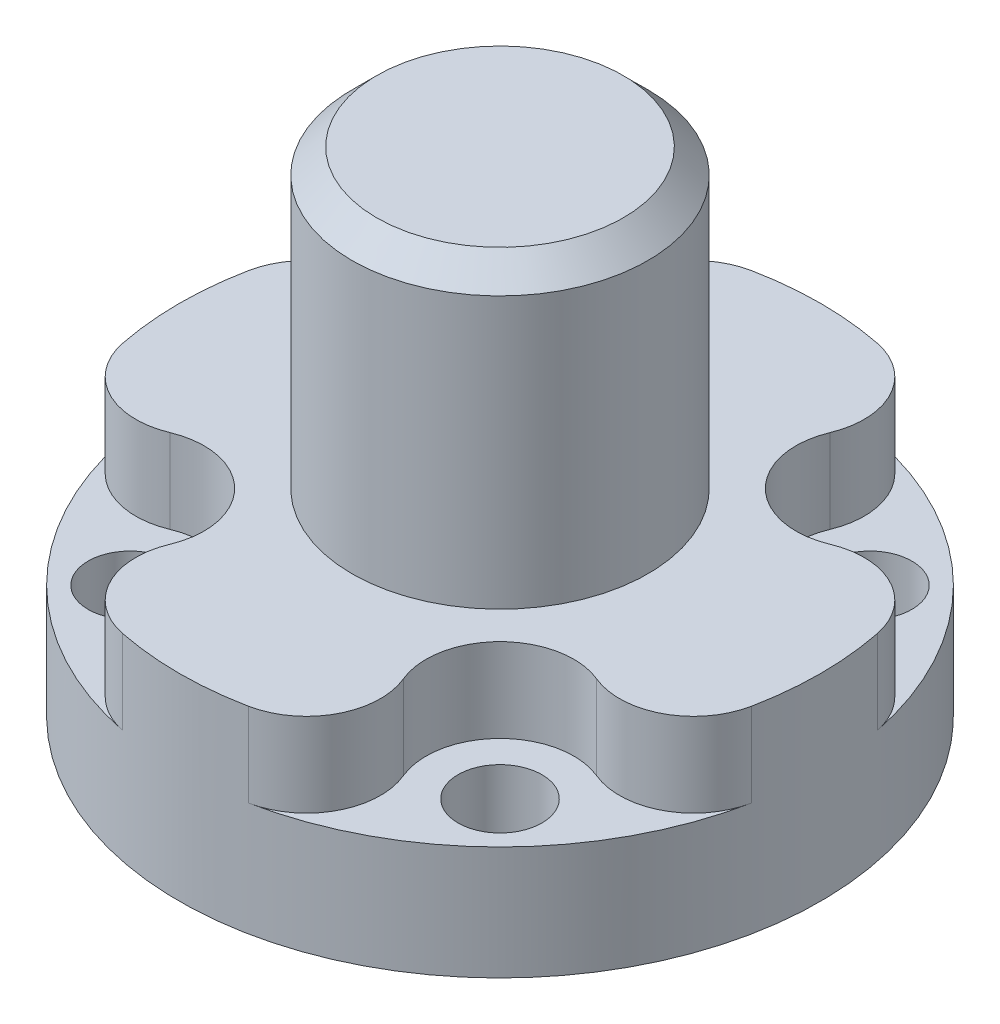
ISO-10303-21;
HEADER;
FILE_DESCRIPTION(('STEP AP214'),'2;1');
FILE_NAME('part.step','',(''),(''),'','','');
FILE_SCHEMA(('AUTOMOTIVE_DESIGN { 1 0 10303 214 1 1 1 1 }'));
ENDSEC;
DATA;
#1=APPLICATION_CONTEXT('core data for automotive mechanical design processes');
#2=APPLICATION_PROTOCOL_DEFINITION('international standard','automotive_design',2000,#1);
#3=PRODUCT_CONTEXT('',#1,'mechanical');
#4=PRODUCT('Part','Part','',(#3));
#5=PRODUCT_RELATED_PRODUCT_CATEGORY('part','',(#4));
#6=PRODUCT_DEFINITION_FORMATION('','',#4);
#7=PRODUCT_DEFINITION_CONTEXT('part definition',#1,'design');
#8=PRODUCT_DEFINITION('design','',#6,#7);
#9=PRODUCT_DEFINITION_SHAPE('','',#8);
#10=(LENGTH_UNIT() NAMED_UNIT(*) SI_UNIT(.MILLI.,.METRE.));
#11=(NAMED_UNIT(*) PLANE_ANGLE_UNIT() SI_UNIT($,.RADIAN.));
#12=(NAMED_UNIT(*) SI_UNIT($,.STERADIAN.) SOLID_ANGLE_UNIT());
#13=UNCERTAINTY_MEASURE_WITH_UNIT(LENGTH_MEASURE(1.E-05),#10,'distance_accuracy_value','');
#14=(GEOMETRIC_REPRESENTATION_CONTEXT(3) GLOBAL_UNCERTAINTY_ASSIGNED_CONTEXT((#13)) GLOBAL_UNIT_ASSIGNED_CONTEXT((#10,
#11,#12)) REPRESENTATION_CONTEXT('',''));
#15=CARTESIAN_POINT('',(0.,0.,0.));
#16=DIRECTION('',(0.,0.,1.));
#17=DIRECTION('',(1.,0.,0.));
#18=AXIS2_PLACEMENT_3D('',#15,#16,#17);
#19=CARTESIAN_POINT('',(0.,20.,0.));
#20=DIRECTION('',(0.,-1.,0.));
#21=DIRECTION('',(0.,0.,-1.));
#22=AXIS2_PLACEMENT_3D('',#19,#20,#21);
#23=CYLINDRICAL_SURFACE('',#22,6.);
#24=CARTESIAN_POINT('',(0.,19.,0.));
#25=DIRECTION('',(0.,1.,0.));
#26=DIRECTION('',(0.,0.,1.));
#27=AXIS2_PLACEMENT_3D('',#24,#25,#26);
#28=CIRCLE('',#27,6.);
#29=CARTESIAN_POINT('',(0.,19.,6.));
#30=VERTEX_POINT('',#29);
#31=EDGE_CURVE('E256',#30,#30,#28,.F.);
#32=ORIENTED_EDGE('',*,*,#31,.T.);
#33=EDGE_LOOP('',(#32));
#34=FACE_BOUND('',#33,.T.);
#35=CARTESIAN_POINT('',(0.,8.,0.));
#36=DIRECTION('',(0.,-1.,0.));
#37=DIRECTION('',(0.,0.,-1.));
#38=AXIS2_PLACEMENT_3D('',#35,#36,#37);
#39=CIRCLE('',#38,6.);
#40=CARTESIAN_POINT('',(0.,8.,-6.));
#41=VERTEX_POINT('',#40);
#42=EDGE_CURVE('E401',#41,#41,#39,.T.);
#43=ORIENTED_EDGE('',*,*,#42,.F.);
#44=EDGE_LOOP('',(#43));
#45=FACE_BOUND('',#44,.T.);
#46=ADVANCED_FACE('F40',(#34,#45),#23,.T.);
#47=CARTESIAN_POINT('',(0.,20.,0.));
#48=DIRECTION('',(0.,1.,0.));
#49=DIRECTION('',(0.,0.,1.));
#50=AXIS2_PLACEMENT_3D('',#47,#48,#49);
#51=PLANE('',#50);
#52=CARTESIAN_POINT('',(0.,20.,0.));
#53=DIRECTION('',(0.,1.,0.));
#54=DIRECTION('',(0.,0.,1.));
#55=AXIS2_PLACEMENT_3D('',#52,#53,#54);
#56=CIRCLE('',#55,5.);
#57=CARTESIAN_POINT('',(0.,20.,5.));
#58=VERTEX_POINT('',#57);
#59=EDGE_CURVE('E253',#58,#58,#56,.T.);
#60=ORIENTED_EDGE('',*,*,#59,.T.);
#61=EDGE_LOOP('',(#60));
#62=FACE_BOUND('',#61,.T.);
#63=ADVANCED_FACE('F275',(#62),#51,.T.);
#64=CARTESIAN_POINT('',(0.,8.,0.));
#65=DIRECTION('',(0.,-1.,0.));
#66=DIRECTION('',(0.,0.,-1.));
#67=AXIS2_PLACEMENT_3D('',#64,#65,#66);
#68=CYLINDRICAL_SURFACE('',#67,13.);
#69=CARTESIAN_POINT('',(0.,8.,0.));
#70=DIRECTION('',(0.,-1.,0.));
#71=DIRECTION('',(0.,0.,-1.));
#72=AXIS2_PLACEMENT_3D('',#69,#70,#71);
#73=CIRCLE('',#72,13.);
#74=CARTESIAN_POINT('',(-2.54901992639096,8.,-12.7476467402757));
#75=VERTEX_POINT('',#74);
#76=CARTESIAN_POINT('',(2.54901992639096,8.,-12.7476467402757));
#77=VERTEX_POINT('',#76);
#78=EDGE_CURVE('E388',#75,#77,#73,.T.);
#79=ORIENTED_EDGE('',*,*,#78,.T.);
#80=DIRECTION('',(0.,-1.,0.));
#81=VECTOR('',#80,1.);
#82=CARTESIAN_POINT('',(2.54901992639096,8.,-12.7476467402757));
#83=LINE('',#82,#81);
#84=CARTESIAN_POINT('',(2.54901992639096,4.6,-12.7476467402757));
#85=VERTEX_POINT('',#84);
#86=EDGE_CURVE('E222',#77,#85,#83,.T.);
#87=ORIENTED_EDGE('',*,*,#86,.T.);
#88=CARTESIAN_POINT('',(0.,4.6,0.));
#89=DIRECTION('',(0.,-1.,0.));
#90=DIRECTION('',(0.,0.,-1.));
#91=AXIS2_PLACEMENT_3D('',#88,#89,#90);
#92=CIRCLE('',#91,13.);
#93=CARTESIAN_POINT('',(12.7476467402757,4.6,-2.54901992639097));
#94=VERTEX_POINT('',#93);
#95=EDGE_CURVE('E163',#94,#85,#92,.F.);
#96=ORIENTED_EDGE('',*,*,#95,.F.);
#97=DIRECTION('',(0.,-1.,0.));
#98=VECTOR('',#97,1.);
#99=CARTESIAN_POINT('',(12.7476467402757,8.,-2.54901992639097));
#100=LINE('',#99,#98);
#101=CARTESIAN_POINT('',(12.7476467402757,8.,-2.54901992639097));
#102=VERTEX_POINT('',#101);
#103=EDGE_CURVE('E210',#94,#102,#100,.F.);
#104=ORIENTED_EDGE('',*,*,#103,.T.);
#105=CARTESIAN_POINT('',(12.7476467402757,8.,2.54901992639096));
#106=VERTEX_POINT('',#105);
#107=EDGE_CURVE('E397',#102,#106,#73,.T.);
#108=ORIENTED_EDGE('',*,*,#107,.T.);
#109=DIRECTION('',(0.,-1.,0.));
#110=VECTOR('',#109,1.);
#111=CARTESIAN_POINT('',(12.7476467402757,8.,2.54901992639096));
#112=LINE('',#111,#110);
#113=CARTESIAN_POINT('',(12.7476467402757,4.6,2.54901992639096));
#114=VERTEX_POINT('',#113);
#115=EDGE_CURVE('E219',#106,#114,#112,.T.);
#116=ORIENTED_EDGE('',*,*,#115,.T.);
#117=CARTESIAN_POINT('',(0.,4.6,0.));
#118=DIRECTION('',(0.,-1.,0.));
#119=DIRECTION('',(0.,0.,-1.));
#120=AXIS2_PLACEMENT_3D('',#117,#118,#119);
#121=CIRCLE('',#120,13.);
#122=CARTESIAN_POINT('',(2.54901992639096,4.6,12.7476467402757));
#123=VERTEX_POINT('',#122);
#124=EDGE_CURVE('E410',#123,#114,#121,.F.);
#125=ORIENTED_EDGE('',*,*,#124,.F.);
#126=DIRECTION('',(0.,-1.,0.));
#127=VECTOR('',#126,1.);
#128=CARTESIAN_POINT('',(2.54901992639096,8.,12.7476467402757));
#129=LINE('',#128,#127);
#130=CARTESIAN_POINT('',(2.54901992639096,8.,12.7476467402757));
#131=VERTEX_POINT('',#130);
#132=EDGE_CURVE('E217',#123,#131,#129,.F.);
#133=ORIENTED_EDGE('',*,*,#132,.T.);
#134=CARTESIAN_POINT('',(-2.54901992639096,8.,12.7476467402757));
#135=VERTEX_POINT('',#134);
#136=EDGE_CURVE('E711',#131,#135,#73,.T.);
#137=ORIENTED_EDGE('',*,*,#136,.T.);
#138=DIRECTION('',(0.,-1.,0.));
#139=VECTOR('',#138,1.);
#140=CARTESIAN_POINT('',(-2.54901992639096,8.,12.7476467402757));
#141=LINE('',#140,#139);
#142=CARTESIAN_POINT('',(-2.54901992639096,4.6,12.7476467402757));
#143=VERTEX_POINT('',#142);
#144=EDGE_CURVE('E214',#135,#143,#141,.T.);
#145=ORIENTED_EDGE('',*,*,#144,.T.);
#146=CARTESIAN_POINT('',(0.,4.6,0.));
#147=DIRECTION('',(0.,-1.,0.));
#148=DIRECTION('',(0.,0.,-1.));
#149=AXIS2_PLACEMENT_3D('',#146,#147,#148);
#150=CIRCLE('',#149,13.);
#151=CARTESIAN_POINT('',(-12.7476467402757,4.6,2.54901992639096));
#152=VERTEX_POINT('',#151);
#153=EDGE_CURVE('E412',#152,#143,#150,.F.);
#154=ORIENTED_EDGE('',*,*,#153,.F.);
#155=DIRECTION('',(0.,-1.,0.));
#156=VECTOR('',#155,1.);
#157=CARTESIAN_POINT('',(-12.7476467402757,8.,2.54901992639096));
#158=LINE('',#157,#156);
#159=CARTESIAN_POINT('',(-12.7476467402757,8.,2.54901992639096));
#160=VERTEX_POINT('',#159);
#161=EDGE_CURVE('E212',#152,#160,#158,.F.);
#162=ORIENTED_EDGE('',*,*,#161,.T.);
#163=CARTESIAN_POINT('',(-12.7476467402757,8.,-2.54901992639096));
#164=VERTEX_POINT('',#163);
#165=EDGE_CURVE('E395',#160,#164,#73,.T.);
#166=ORIENTED_EDGE('',*,*,#165,.T.);
#167=DIRECTION('',(0.,-1.,0.));
#168=VECTOR('',#167,1.);
#169=CARTESIAN_POINT('',(-12.7476467402757,8.,-2.54901992639096));
#170=LINE('',#169,#168);
#171=CARTESIAN_POINT('',(-12.7476467402757,4.6,-2.54901992639096));
#172=VERTEX_POINT('',#171);
#173=EDGE_CURVE('E207',#164,#172,#170,.T.);
#174=ORIENTED_EDGE('',*,*,#173,.T.);
#175=CARTESIAN_POINT('',(0.,4.6,0.));
#176=DIRECTION('',(0.,-1.,0.));
#177=DIRECTION('',(0.,0.,-1.));
#178=AXIS2_PLACEMENT_3D('',#175,#176,#177);
#179=CIRCLE('',#178,13.);
#180=CARTESIAN_POINT('',(-2.54901992639096,4.6,-12.7476467402757));
#181=VERTEX_POINT('',#180);
#182=EDGE_CURVE('E189',#181,#172,#179,.F.);
#183=ORIENTED_EDGE('',*,*,#182,.F.);
#184=DIRECTION('',(0.,-1.,0.));
#185=VECTOR('',#184,1.);
#186=CARTESIAN_POINT('',(-2.54901992639096,8.,-12.7476467402757));
#187=LINE('',#186,#185);
#188=EDGE_CURVE('E205',#181,#75,#187,.F.);
#189=ORIENTED_EDGE('',*,*,#188,.T.);
#190=EDGE_LOOP('',(#79,#87,#96,#104,#108,#116,#125,#133,#137,#145,#154,#162,#166,#174,#183,#189));
#191=FACE_BOUND('',#190,.T.);
#192=CARTESIAN_POINT('',(0.,0.,0.));
#193=DIRECTION('',(0.,-1.,0.));
#194=DIRECTION('',(0.,0.,-1.));
#195=AXIS2_PLACEMENT_3D('',#192,#193,#194);
#196=CIRCLE('',#195,13.);
#197=CARTESIAN_POINT('',(0.,0.,-13.));
#198=VERTEX_POINT('',#197);
#199=EDGE_CURVE('E391',#198,#198,#196,.T.);
#200=ORIENTED_EDGE('',*,*,#199,.F.);
#201=EDGE_LOOP('',(#200));
#202=FACE_BOUND('',#201,.T.);
#203=ADVANCED_FACE('F281',(#191,#202),#68,.T.);
#204=CARTESIAN_POINT('',(0.,8.,0.));
#205=DIRECTION('',(0.,-1.,0.));
#206=DIRECTION('',(0.,0.,-1.));
#207=AXIS2_PLACEMENT_3D('',#204,#205,#206);
#208=PLANE('',#207);
#209=ORIENTED_EDGE('',*,*,#42,.T.);
#210=EDGE_LOOP('',(#209));
#211=FACE_BOUND('',#210,.T.);
#212=CARTESIAN_POINT('',(7.5,8.,-7.5));
#213=DIRECTION('',(0.,-1.,0.));
#214=DIRECTION('',(0.,0.,-1.));
#215=AXIS2_PLACEMENT_3D('',#212,#213,#214);
#216=CIRCLE('',#215,3.);
#217=CARTESIAN_POINT('',(8.65294105395219,8.,-4.73039227938114));
#218=VERTEX_POINT('',#217);
#219=CARTESIAN_POINT('',(4.73039227938114,8.,-8.6529410539522));
#220=VERTEX_POINT('',#219);
#221=EDGE_CURVE('E404',#218,#220,#216,.T.);
#222=ORIENTED_EDGE('',*,*,#221,.T.);
#223=CARTESIAN_POINT('',(1.96078455876228,8.,-9.80588210790439));
#224=DIRECTION('',(0.,-1.,0.));
#225=DIRECTION('',(0.,0.,-1.));
#226=AXIS2_PLACEMENT_3D('',#223,#224,#225);
#227=CIRCLE('',#226,3.);
#228=EDGE_CURVE('E184',#220,#77,#227,.F.);
#229=ORIENTED_EDGE('',*,*,#228,.T.);
#230=ORIENTED_EDGE('',*,*,#78,.F.);
#231=CARTESIAN_POINT('',(-1.96078455876228,8.,-9.80588210790439));
#232=DIRECTION('',(0.,-1.,0.));
#233=DIRECTION('',(0.,0.,-1.));
#234=AXIS2_PLACEMENT_3D('',#231,#232,#233);
#235=CIRCLE('',#234,3.);
#236=CARTESIAN_POINT('',(-4.73039227938114,8.,-8.65294105395219));
#237=VERTEX_POINT('',#236);
#238=EDGE_CURVE('E185',#75,#237,#235,.F.);
#239=ORIENTED_EDGE('',*,*,#238,.T.);
#240=CARTESIAN_POINT('',(-7.5,8.,-7.5));
#241=DIRECTION('',(0.,-1.,0.));
#242=DIRECTION('',(0.,0.,-1.));
#243=AXIS2_PLACEMENT_3D('',#240,#241,#242);
#244=CIRCLE('',#243,3.);
#245=CARTESIAN_POINT('',(-8.6529410539522,8.,-4.73039227938114));
#246=VERTEX_POINT('',#245);
#247=EDGE_CURVE('E414',#237,#246,#244,.T.);
#248=ORIENTED_EDGE('',*,*,#247,.T.);
#249=CARTESIAN_POINT('',(-9.80588210790439,8.,-1.96078455876228));
#250=DIRECTION('',(0.,-1.,0.));
#251=DIRECTION('',(0.,0.,-1.));
#252=AXIS2_PLACEMENT_3D('',#249,#250,#251);
#253=CIRCLE('',#252,3.);
#254=EDGE_CURVE('E187',#246,#164,#253,.F.);
#255=ORIENTED_EDGE('',*,*,#254,.T.);
#256=ORIENTED_EDGE('',*,*,#165,.F.);
#257=CARTESIAN_POINT('',(-9.80588210790439,8.,1.96078455876228));
#258=DIRECTION('',(0.,-1.,0.));
#259=DIRECTION('',(0.,0.,-1.));
#260=AXIS2_PLACEMENT_3D('',#257,#258,#259);
#261=CIRCLE('',#260,3.);
#262=CARTESIAN_POINT('',(-8.6529410539522,8.,4.73039227938114));
#263=VERTEX_POINT('',#262);
#264=EDGE_CURVE('E196',#160,#263,#261,.F.);
#265=ORIENTED_EDGE('',*,*,#264,.T.);
#266=CARTESIAN_POINT('',(-7.5,8.,7.5));
#267=DIRECTION('',(0.,1.,0.));
#268=DIRECTION('',(0.,0.,1.));
#269=AXIS2_PLACEMENT_3D('',#266,#267,#268);
#270=CIRCLE('',#269,3.);
#271=CARTESIAN_POINT('',(-4.73039227938114,8.,8.65294105395219));
#272=VERTEX_POINT('',#271);
#273=EDGE_CURVE('E433',#272,#263,#270,.T.);
#274=ORIENTED_EDGE('',*,*,#273,.F.);
#275=CARTESIAN_POINT('',(-1.96078455876228,8.,9.80588210790439));
#276=DIRECTION('',(0.,-1.,0.));
#277=DIRECTION('',(0.,0.,-1.));
#278=AXIS2_PLACEMENT_3D('',#275,#276,#277);
#279=CIRCLE('',#278,3.);
#280=EDGE_CURVE('E198',#272,#135,#279,.F.);
#281=ORIENTED_EDGE('',*,*,#280,.T.);
#282=ORIENTED_EDGE('',*,*,#136,.F.);
#283=CARTESIAN_POINT('',(1.96078455876228,8.,9.80588210790439));
#284=DIRECTION('',(0.,-1.,0.));
#285=DIRECTION('',(0.,0.,-1.));
#286=AXIS2_PLACEMENT_3D('',#283,#284,#285);
#287=CIRCLE('',#286,3.);
#288=CARTESIAN_POINT('',(4.73039227938114,8.,8.65294105395219));
#289=VERTEX_POINT('',#288);
#290=EDGE_CURVE('E200',#131,#289,#287,.F.);
#291=ORIENTED_EDGE('',*,*,#290,.T.);
#292=CARTESIAN_POINT('',(7.5,8.,7.5));
#293=DIRECTION('',(0.,-1.,0.));
#294=DIRECTION('',(0.,0.,-1.));
#295=AXIS2_PLACEMENT_3D('',#292,#293,#294);
#296=CIRCLE('',#295,3.);
#297=CARTESIAN_POINT('',(8.6529410539522,8.,4.73039227938114));
#298=VERTEX_POINT('',#297);
#299=EDGE_CURVE('E407',#289,#298,#296,.T.);
#300=ORIENTED_EDGE('',*,*,#299,.T.);
#301=CARTESIAN_POINT('',(9.80588210790439,8.,1.96078455876228));
#302=DIRECTION('',(0.,-1.,0.));
#303=DIRECTION('',(0.,0.,-1.));
#304=AXIS2_PLACEMENT_3D('',#301,#302,#303);
#305=CIRCLE('',#304,3.);
#306=EDGE_CURVE('E202',#298,#106,#305,.F.);
#307=ORIENTED_EDGE('',*,*,#306,.T.);
#308=ORIENTED_EDGE('',*,*,#107,.F.);
#309=CARTESIAN_POINT('',(9.80588210790439,8.,-1.96078455876228));
#310=DIRECTION('',(0.,-1.,0.));
#311=DIRECTION('',(0.,0.,-1.));
#312=AXIS2_PLACEMENT_3D('',#309,#310,#311);
#313=CIRCLE('',#312,3.);
#314=EDGE_CURVE('E194',#102,#218,#313,.F.);
#315=ORIENTED_EDGE('',*,*,#314,.T.);
#316=EDGE_LOOP('',(#222,#229,#230,#239,#248,#255,#256,#265,#274,#281,#282,#291,#300,#307,#308,#315));
#317=FACE_BOUND('',#316,.T.);
#318=ADVANCED_FACE('F377',(#211,#317),#208,.F.);
#319=CARTESIAN_POINT('',(0.,0.,0.));
#320=DIRECTION('',(0.,1.,0.));
#321=DIRECTION('',(0.,0.,1.));
#322=AXIS2_PLACEMENT_3D('',#319,#320,#321);
#323=PLANE('',#322);
#324=CARTESIAN_POINT('',(0.,0.,0.));
#325=DIRECTION('',(0.,1.,0.));
#326=DIRECTION('',(0.,0.,1.));
#327=AXIS2_PLACEMENT_3D('',#324,#325,#326);
#328=CIRCLE('',#327,3.);
#329=CARTESIAN_POINT('',(0.,0.,3.));
#330=VERTEX_POINT('',#329);
#331=EDGE_CURVE('E259',#330,#330,#328,.F.);
#332=ORIENTED_EDGE('',*,*,#331,.F.);
#333=EDGE_LOOP('',(#332));
#334=FACE_BOUND('',#333,.T.);
#335=CARTESIAN_POINT('',(-7.5,0.,-7.5));
#336=DIRECTION('',(0.,1.,0.));
#337=DIRECTION('',(0.,0.,1.));
#338=AXIS2_PLACEMENT_3D('',#335,#336,#337);
#339=CIRCLE('',#338,1.7);
#340=CARTESIAN_POINT('',(-7.5,0.,-5.8));
#341=VERTEX_POINT('',#340);
#342=EDGE_CURVE('E428',#341,#341,#339,.T.);
#343=ORIENTED_EDGE('',*,*,#342,.T.);
#344=EDGE_LOOP('',(#343));
#345=FACE_BOUND('',#344,.T.);
#346=CARTESIAN_POINT('',(-7.5,0.,7.5));
#347=DIRECTION('',(0.,1.,0.));
#348=DIRECTION('',(0.,0.,1.));
#349=AXIS2_PLACEMENT_3D('',#346,#347,#348);
#350=CIRCLE('',#349,1.7);
#351=CARTESIAN_POINT('',(-7.5,0.,9.2));
#352=VERTEX_POINT('',#351);
#353=EDGE_CURVE('E442',#352,#352,#350,.T.);
#354=ORIENTED_EDGE('',*,*,#353,.T.);
#355=EDGE_LOOP('',(#354));
#356=FACE_BOUND('',#355,.T.);
#357=CARTESIAN_POINT('',(7.5,0.,7.5));
#358=DIRECTION('',(0.,1.,0.));
#359=DIRECTION('',(0.,0.,1.));
#360=AXIS2_PLACEMENT_3D('',#357,#358,#359);
#361=CIRCLE('',#360,1.7);
#362=CARTESIAN_POINT('',(7.5,0.,9.2));
#363=VERTEX_POINT('',#362);
#364=EDGE_CURVE('E181',#363,#363,#361,.T.);
#365=ORIENTED_EDGE('',*,*,#364,.T.);
#366=EDGE_LOOP('',(#365));
#367=FACE_BOUND('',#366,.T.);
#368=CARTESIAN_POINT('',(7.5,0.,-7.5));
#369=DIRECTION('',(0.,1.,0.));
#370=DIRECTION('',(0.,0.,1.));
#371=AXIS2_PLACEMENT_3D('',#368,#369,#370);
#372=CIRCLE('',#371,1.7);
#373=CARTESIAN_POINT('',(7.5,0.,-5.80000000000001));
#374=VERTEX_POINT('',#373);
#375=EDGE_CURVE('E393',#374,#374,#372,.T.);
#376=ORIENTED_EDGE('',*,*,#375,.T.);
#377=EDGE_LOOP('',(#376));
#378=FACE_BOUND('',#377,.T.);
#379=ORIENTED_EDGE('',*,*,#199,.T.);
#380=EDGE_LOOP('',(#379));
#381=FACE_BOUND('',#380,.T.);
#382=ADVANCED_FACE('F287',(#334,#345,#356,#367,#378,#381),#323,.F.);
#383=CARTESIAN_POINT('',(7.5,8.,-7.5));
#384=DIRECTION('',(0.,1.,0.));
#385=DIRECTION('',(0.,0.,1.));
#386=AXIS2_PLACEMENT_3D('',#383,#384,#385);
#387=CYLINDRICAL_SURFACE('',#386,1.7);
#388=ORIENTED_EDGE('',*,*,#375,.F.);
#389=EDGE_LOOP('',(#388));
#390=FACE_BOUND('',#389,.T.);
#391=CARTESIAN_POINT('',(7.5,4.6,-7.5));
#392=DIRECTION('',(0.,1.,0.));
#393=DIRECTION('',(0.,0.,1.));
#394=AXIS2_PLACEMENT_3D('',#391,#392,#393);
#395=CIRCLE('',#394,1.7);
#396=CARTESIAN_POINT('',(7.5,4.6,-5.8));
#397=VERTEX_POINT('',#396);
#398=EDGE_CURVE('E180',#397,#397,#395,.T.);
#399=ORIENTED_EDGE('',*,*,#398,.T.);
#400=EDGE_LOOP('',(#399));
#401=FACE_BOUND('',#400,.T.);
#402=ADVANCED_FACE('F373',(#390,#401),#387,.F.);
#403=CARTESIAN_POINT('',(9.2,4.6,-7.5));
#404=DIRECTION('',(0.,-1.,0.));
#405=DIRECTION('',(0.,0.,-1.));
#406=AXIS2_PLACEMENT_3D('',#403,#404,#405);
#407=PLANE('',#406);
#408=ORIENTED_EDGE('',*,*,#95,.T.);
#409=CARTESIAN_POINT('',(1.96078455876228,4.6,-9.80588210790439));
#410=DIRECTION('',(0.,-1.,0.));
#411=DIRECTION('',(0.,0.,-1.));
#412=AXIS2_PLACEMENT_3D('',#409,#410,#411);
#413=CIRCLE('',#412,3.);
#414=CARTESIAN_POINT('',(4.73039227938114,4.6,-8.6529410539522));
#415=VERTEX_POINT('',#414);
#416=EDGE_CURVE('E157',#85,#415,#413,.T.);
#417=ORIENTED_EDGE('',*,*,#416,.T.);
#418=CARTESIAN_POINT('',(7.5,4.6,-7.5));
#419=DIRECTION('',(0.,1.,0.));
#420=DIRECTION('',(0.,0.,1.));
#421=AXIS2_PLACEMENT_3D('',#418,#419,#420);
#422=CIRCLE('',#421,3.);
#423=CARTESIAN_POINT('',(8.65294105395219,4.6,-4.73039227938114));
#424=VERTEX_POINT('',#423);
#425=EDGE_CURVE('E162',#415,#424,#422,.T.);
#426=ORIENTED_EDGE('',*,*,#425,.T.);
#427=CARTESIAN_POINT('',(9.80588210790439,4.6,-1.96078455876228));
#428=DIRECTION('',(0.,-1.,0.));
#429=DIRECTION('',(0.,0.,-1.));
#430=AXIS2_PLACEMENT_3D('',#427,#428,#429);
#431=CIRCLE('',#430,3.);
#432=EDGE_CURVE('E249',#424,#94,#431,.T.);
#433=ORIENTED_EDGE('',*,*,#432,.T.);
#434=EDGE_LOOP('',(#408,#417,#426,#433));
#435=FACE_BOUND('',#434,.T.);
#436=ORIENTED_EDGE('',*,*,#398,.F.);
#437=EDGE_LOOP('',(#436));
#438=FACE_BOUND('',#437,.T.);
#439=ADVANCED_FACE('F159',(#435,#438),#407,.F.);
#440=CARTESIAN_POINT('',(7.5,8.,-7.5));
#441=DIRECTION('',(0.,1.,0.));
#442=DIRECTION('',(0.,0.,1.));
#443=AXIS2_PLACEMENT_3D('',#440,#441,#442);
#444=CYLINDRICAL_SURFACE('',#443,3.);
#445=ORIENTED_EDGE('',*,*,#425,.F.);
#446=DIRECTION('',(0.,1.,0.));
#447=VECTOR('',#446,1.);
#448=CARTESIAN_POINT('',(4.73039227938114,8.,-8.6529410539522));
#449=LINE('',#448,#447);
#450=EDGE_CURVE('E176',#415,#220,#449,.T.);
#451=ORIENTED_EDGE('',*,*,#450,.T.);
#452=ORIENTED_EDGE('',*,*,#221,.F.);
#453=DIRECTION('',(0.,1.,0.));
#454=VECTOR('',#453,1.);
#455=CARTESIAN_POINT('',(8.65294105395219,8.,-4.73039227938114));
#456=LINE('',#455,#454);
#457=EDGE_CURVE('E179',#218,#424,#456,.F.);
#458=ORIENTED_EDGE('',*,*,#457,.T.);
#459=EDGE_LOOP('',(#445,#451,#452,#458));
#460=FACE_BOUND('',#459,.T.);
#461=ADVANCED_FACE('F174',(#460),#444,.F.);
#462=CARTESIAN_POINT('',(7.5,8.,7.5));
#463=DIRECTION('',(0.,1.,0.));
#464=DIRECTION('',(0.,0.,1.));
#465=AXIS2_PLACEMENT_3D('',#462,#463,#464);
#466=CYLINDRICAL_SURFACE('',#465,1.7);
#467=ORIENTED_EDGE('',*,*,#364,.F.);
#468=EDGE_LOOP('',(#467));
#469=FACE_BOUND('',#468,.T.);
#470=CARTESIAN_POINT('',(7.5,4.6,7.5));
#471=DIRECTION('',(0.,1.,0.));
#472=DIRECTION('',(0.,0.,1.));
#473=AXIS2_PLACEMENT_3D('',#470,#471,#472);
#474=CIRCLE('',#473,1.7);
#475=CARTESIAN_POINT('',(7.5,4.6,9.2));
#476=VERTEX_POINT('',#475);
#477=EDGE_CURVE('E448',#476,#476,#474,.T.);
#478=ORIENTED_EDGE('',*,*,#477,.T.);
#479=EDGE_LOOP('',(#478));
#480=FACE_BOUND('',#479,.T.);
#481=ADVANCED_FACE('F364',(#469,#480),#466,.F.);
#482=CARTESIAN_POINT('',(9.2,4.6,7.5));
#483=DIRECTION('',(0.,-1.,0.));
#484=DIRECTION('',(0.,0.,-1.));
#485=AXIS2_PLACEMENT_3D('',#482,#483,#484);
#486=PLANE('',#485);
#487=ORIENTED_EDGE('',*,*,#124,.T.);
#488=CARTESIAN_POINT('',(9.80588210790439,4.6,1.96078455876228));
#489=DIRECTION('',(0.,-1.,0.));
#490=DIRECTION('',(0.,0.,-1.));
#491=AXIS2_PLACEMENT_3D('',#488,#489,#490);
#492=CIRCLE('',#491,3.);
#493=CARTESIAN_POINT('',(8.6529410539522,4.6,4.73039227938114));
#494=VERTEX_POINT('',#493);
#495=EDGE_CURVE('E168',#114,#494,#492,.T.);
#496=ORIENTED_EDGE('',*,*,#495,.T.);
#497=CARTESIAN_POINT('',(7.5,4.6,7.5));
#498=DIRECTION('',(0.,1.,0.));
#499=DIRECTION('',(0.,0.,1.));
#500=AXIS2_PLACEMENT_3D('',#497,#498,#499);
#501=CIRCLE('',#500,3.);
#502=CARTESIAN_POINT('',(4.73039227938114,4.6,8.65294105395219));
#503=VERTEX_POINT('',#502);
#504=EDGE_CURVE('E445',#494,#503,#501,.T.);
#505=ORIENTED_EDGE('',*,*,#504,.T.);
#506=CARTESIAN_POINT('',(1.96078455876228,4.6,9.80588210790439));
#507=DIRECTION('',(0.,-1.,0.));
#508=DIRECTION('',(0.,0.,-1.));
#509=AXIS2_PLACEMENT_3D('',#506,#507,#508);
#510=CIRCLE('',#509,3.);
#511=EDGE_CURVE('E241',#503,#123,#510,.T.);
#512=ORIENTED_EDGE('',*,*,#511,.T.);
#513=EDGE_LOOP('',(#487,#496,#505,#512));
#514=FACE_BOUND('',#513,.T.);
#515=ORIENTED_EDGE('',*,*,#477,.F.);
#516=EDGE_LOOP('',(#515));
#517=FACE_BOUND('',#516,.T.);
#518=ADVANCED_FACE('F360',(#514,#517),#486,.F.);
#519=CARTESIAN_POINT('',(7.5,8.,7.5));
#520=DIRECTION('',(0.,1.,0.));
#521=DIRECTION('',(0.,0.,1.));
#522=AXIS2_PLACEMENT_3D('',#519,#520,#521);
#523=CYLINDRICAL_SURFACE('',#522,3.);
#524=ORIENTED_EDGE('',*,*,#504,.F.);
#525=DIRECTION('',(0.,1.,0.));
#526=VECTOR('',#525,1.);
#527=CARTESIAN_POINT('',(8.6529410539522,8.,4.73039227938114));
#528=LINE('',#527,#526);
#529=EDGE_CURVE('E227',#494,#298,#528,.T.);
#530=ORIENTED_EDGE('',*,*,#529,.T.);
#531=ORIENTED_EDGE('',*,*,#299,.F.);
#532=DIRECTION('',(0.,1.,0.));
#533=VECTOR('',#532,1.);
#534=CARTESIAN_POINT('',(4.73039227938114,8.,8.65294105395219));
#535=LINE('',#534,#533);
#536=EDGE_CURVE('E224',#289,#503,#535,.F.);
#537=ORIENTED_EDGE('',*,*,#536,.T.);
#538=EDGE_LOOP('',(#524,#530,#531,#537));
#539=FACE_BOUND('',#538,.T.);
#540=ADVANCED_FACE('F356',(#539),#523,.F.);
#541=CARTESIAN_POINT('',(-7.5,8.,7.5));
#542=DIRECTION('',(0.,1.,0.));
#543=DIRECTION('',(0.,0.,1.));
#544=AXIS2_PLACEMENT_3D('',#541,#542,#543);
#545=CYLINDRICAL_SURFACE('',#544,1.7);
#546=ORIENTED_EDGE('',*,*,#353,.F.);
#547=EDGE_LOOP('',(#546));
#548=FACE_BOUND('',#547,.T.);
#549=CARTESIAN_POINT('',(-7.5,4.6,7.5));
#550=DIRECTION('',(0.,1.,0.));
#551=DIRECTION('',(0.,0.,1.));
#552=AXIS2_PLACEMENT_3D('',#549,#550,#551);
#553=CIRCLE('',#552,1.7);
#554=CARTESIAN_POINT('',(-7.5,4.6,9.2));
#555=VERTEX_POINT('',#554);
#556=EDGE_CURVE('E439',#555,#555,#553,.T.);
#557=ORIENTED_EDGE('',*,*,#556,.T.);
#558=EDGE_LOOP('',(#557));
#559=FACE_BOUND('',#558,.T.);
#560=ADVANCED_FACE('F352',(#548,#559),#545,.F.);
#561=CARTESIAN_POINT('',(-5.8,4.6,7.5));
#562=DIRECTION('',(0.,-1.,0.));
#563=DIRECTION('',(0.,0.,-1.));
#564=AXIS2_PLACEMENT_3D('',#561,#562,#563);
#565=PLANE('',#564);
#566=ORIENTED_EDGE('',*,*,#153,.T.);
#567=CARTESIAN_POINT('',(-1.96078455876228,4.6,9.80588210790439));
#568=DIRECTION('',(0.,-1.,0.));
#569=DIRECTION('',(0.,0.,-1.));
#570=AXIS2_PLACEMENT_3D('',#567,#568,#569);
#571=CIRCLE('',#570,3.);
#572=CARTESIAN_POINT('',(-4.73039227938114,4.6,8.65294105395219));
#573=VERTEX_POINT('',#572);
#574=EDGE_CURVE('E244',#143,#573,#571,.T.);
#575=ORIENTED_EDGE('',*,*,#574,.T.);
#576=CARTESIAN_POINT('',(-7.5,4.6,7.5));
#577=DIRECTION('',(0.,1.,0.));
#578=DIRECTION('',(0.,0.,1.));
#579=AXIS2_PLACEMENT_3D('',#576,#577,#578);
#580=CIRCLE('',#579,3.);
#581=CARTESIAN_POINT('',(-8.6529410539522,4.6,4.73039227938114));
#582=VERTEX_POINT('',#581);
#583=EDGE_CURVE('E436',#573,#582,#580,.T.);
#584=ORIENTED_EDGE('',*,*,#583,.T.);
#585=CARTESIAN_POINT('',(-9.80588210790439,4.6,1.96078455876228));
#586=DIRECTION('',(0.,-1.,0.));
#587=DIRECTION('',(0.,0.,-1.));
#588=AXIS2_PLACEMENT_3D('',#585,#586,#587);
#589=CIRCLE('',#588,3.);
#590=EDGE_CURVE('E246',#582,#152,#589,.T.);
#591=ORIENTED_EDGE('',*,*,#590,.T.);
#592=EDGE_LOOP('',(#566,#575,#584,#591));
#593=FACE_BOUND('',#592,.T.);
#594=ORIENTED_EDGE('',*,*,#556,.F.);
#595=EDGE_LOOP('',(#594));
#596=FACE_BOUND('',#595,.T.);
#597=ADVANCED_FACE('F348',(#593,#596),#565,.F.);
#598=CARTESIAN_POINT('',(-7.5,8.,7.5));
#599=DIRECTION('',(0.,1.,0.));
#600=DIRECTION('',(0.,0.,1.));
#601=AXIS2_PLACEMENT_3D('',#598,#599,#600);
#602=CYLINDRICAL_SURFACE('',#601,3.);
#603=ORIENTED_EDGE('',*,*,#583,.F.);
#604=DIRECTION('',(0.,1.,0.));
#605=VECTOR('',#604,1.);
#606=CARTESIAN_POINT('',(-4.73039227938114,8.,8.65294105395219));
#607=LINE('',#606,#605);
#608=EDGE_CURVE('E233',#573,#272,#607,.T.);
#609=ORIENTED_EDGE('',*,*,#608,.T.);
#610=ORIENTED_EDGE('',*,*,#273,.T.);
#611=DIRECTION('',(0.,1.,0.));
#612=VECTOR('',#611,1.);
#613=CARTESIAN_POINT('',(-8.6529410539522,8.,4.73039227938114));
#614=LINE('',#613,#612);
#615=EDGE_CURVE('E230',#263,#582,#614,.F.);
#616=ORIENTED_EDGE('',*,*,#615,.T.);
#617=EDGE_LOOP('',(#603,#609,#610,#616));
#618=FACE_BOUND('',#617,.T.);
#619=ADVANCED_FACE('F344',(#618),#602,.F.);
#620=CARTESIAN_POINT('',(-7.5,8.,-7.5));
#621=DIRECTION('',(0.,1.,0.));
#622=DIRECTION('',(0.,0.,1.));
#623=AXIS2_PLACEMENT_3D('',#620,#621,#622);
#624=CYLINDRICAL_SURFACE('',#623,1.7);
#625=ORIENTED_EDGE('',*,*,#342,.F.);
#626=EDGE_LOOP('',(#625));
#627=FACE_BOUND('',#626,.T.);
#628=CARTESIAN_POINT('',(-7.5,4.6,-7.5));
#629=DIRECTION('',(0.,1.,0.));
#630=DIRECTION('',(0.,0.,1.));
#631=AXIS2_PLACEMENT_3D('',#628,#629,#630);
#632=CIRCLE('',#631,1.7);
#633=CARTESIAN_POINT('',(-7.5,4.6,-5.8));
#634=VERTEX_POINT('',#633);
#635=EDGE_CURVE('E425',#634,#634,#632,.T.);
#636=ORIENTED_EDGE('',*,*,#635,.T.);
#637=EDGE_LOOP('',(#636));
#638=FACE_BOUND('',#637,.T.);
#639=ADVANCED_FACE('F341',(#627,#638),#624,.F.);
#640=CARTESIAN_POINT('',(-5.8,4.6,-7.5));
#641=DIRECTION('',(0.,-1.,0.));
#642=DIRECTION('',(0.,0.,-1.));
#643=AXIS2_PLACEMENT_3D('',#640,#641,#642);
#644=PLANE('',#643);
#645=ORIENTED_EDGE('',*,*,#182,.T.);
#646=CARTESIAN_POINT('',(-9.80588210790439,4.6,-1.96078455876228));
#647=DIRECTION('',(0.,-1.,0.));
#648=DIRECTION('',(0.,0.,-1.));
#649=AXIS2_PLACEMENT_3D('',#646,#647,#648);
#650=CIRCLE('',#649,3.);
#651=CARTESIAN_POINT('',(-8.6529410539522,4.6,-4.73039227938114));
#652=VERTEX_POINT('',#651);
#653=EDGE_CURVE('E64',#172,#652,#650,.T.);
#654=ORIENTED_EDGE('',*,*,#653,.T.);
#655=CARTESIAN_POINT('',(-7.5,4.6,-7.5));
#656=DIRECTION('',(0.,1.,0.));
#657=DIRECTION('',(0.,0.,1.));
#658=AXIS2_PLACEMENT_3D('',#655,#656,#657);
#659=CIRCLE('',#658,3.);
#660=CARTESIAN_POINT('',(-4.73039227938114,4.6,-8.65294105395219));
#661=VERTEX_POINT('',#660);
#662=EDGE_CURVE('E422',#652,#661,#659,.T.);
#663=ORIENTED_EDGE('',*,*,#662,.T.);
#664=CARTESIAN_POINT('',(-1.96078455876228,4.6,-9.80588210790439));
#665=DIRECTION('',(0.,-1.,0.));
#666=DIRECTION('',(0.,0.,-1.));
#667=AXIS2_PLACEMENT_3D('',#664,#665,#666);
#668=CIRCLE('',#667,3.);
#669=EDGE_CURVE('E56',#661,#181,#668,.T.);
#670=ORIENTED_EDGE('',*,*,#669,.T.);
#671=EDGE_LOOP('',(#645,#654,#663,#670));
#672=FACE_BOUND('',#671,.T.);
#673=ORIENTED_EDGE('',*,*,#635,.F.);
#674=EDGE_LOOP('',(#673));
#675=FACE_BOUND('',#674,.T.);
#676=ADVANCED_FACE('F337',(#672,#675),#644,.F.);
#677=CARTESIAN_POINT('',(-7.5,8.,-7.5));
#678=DIRECTION('',(0.,1.,0.));
#679=DIRECTION('',(0.,0.,1.));
#680=AXIS2_PLACEMENT_3D('',#677,#678,#679);
#681=CYLINDRICAL_SURFACE('',#680,3.);
#682=ORIENTED_EDGE('',*,*,#662,.F.);
#683=DIRECTION('',(0.,1.,0.));
#684=VECTOR('',#683,1.);
#685=CARTESIAN_POINT('',(-8.6529410539522,8.,-4.73039227938114));
#686=LINE('',#685,#684);
#687=EDGE_CURVE('E169',#652,#246,#686,.T.);
#688=ORIENTED_EDGE('',*,*,#687,.T.);
#689=ORIENTED_EDGE('',*,*,#247,.F.);
#690=DIRECTION('',(0.,1.,0.));
#691=VECTOR('',#690,1.);
#692=CARTESIAN_POINT('',(-4.73039227938114,8.,-8.65294105395219));
#693=LINE('',#692,#691);
#694=EDGE_CURVE('E236',#237,#661,#693,.F.);
#695=ORIENTED_EDGE('',*,*,#694,.T.);
#696=EDGE_LOOP('',(#682,#688,#689,#695));
#697=FACE_BOUND('',#696,.T.);
#698=ADVANCED_FACE('F291',(#697),#681,.F.);
#699=CARTESIAN_POINT('',(1.96078455876228,8.,-9.80588210790439));
#700=DIRECTION('',(0.,-1.,0.));
#701=DIRECTION('',(0.,0.,-1.));
#702=AXIS2_PLACEMENT_3D('',#699,#700,#701);
#703=CYLINDRICAL_SURFACE('',#702,3.);
#704=ORIENTED_EDGE('',*,*,#416,.F.);
#705=ORIENTED_EDGE('',*,*,#86,.F.);
#706=ORIENTED_EDGE('',*,*,#228,.F.);
#707=ORIENTED_EDGE('',*,*,#450,.F.);
#708=EDGE_LOOP('',(#704,#705,#706,#707));
#709=FACE_BOUND('',#708,.T.);
#710=ADVANCED_FACE('F183',(#709),#703,.T.);
#711=CARTESIAN_POINT('',(9.80588210790439,8.,1.96078455876228));
#712=DIRECTION('',(0.,-1.,0.));
#713=DIRECTION('',(0.,0.,-1.));
#714=AXIS2_PLACEMENT_3D('',#711,#712,#713);
#715=CYLINDRICAL_SURFACE('',#714,3.);
#716=ORIENTED_EDGE('',*,*,#495,.F.);
#717=ORIENTED_EDGE('',*,*,#115,.F.);
#718=ORIENTED_EDGE('',*,*,#306,.F.);
#719=ORIENTED_EDGE('',*,*,#529,.F.);
#720=EDGE_LOOP('',(#716,#717,#718,#719));
#721=FACE_BOUND('',#720,.T.);
#722=ADVANCED_FACE('F290',(#721),#715,.T.);
#723=CARTESIAN_POINT('',(1.96078455876228,8.,9.80588210790439));
#724=DIRECTION('',(0.,1.,0.));
#725=DIRECTION('',(0.,0.,1.));
#726=AXIS2_PLACEMENT_3D('',#723,#724,#725);
#727=CYLINDRICAL_SURFACE('',#726,3.);
#728=ORIENTED_EDGE('',*,*,#290,.F.);
#729=ORIENTED_EDGE('',*,*,#132,.F.);
#730=ORIENTED_EDGE('',*,*,#511,.F.);
#731=ORIENTED_EDGE('',*,*,#536,.F.);
#732=EDGE_LOOP('',(#728,#729,#730,#731));
#733=FACE_BOUND('',#732,.T.);
#734=ADVANCED_FACE('F294',(#733),#727,.T.);
#735=CARTESIAN_POINT('',(-1.96078455876228,8.,9.80588210790439));
#736=DIRECTION('',(0.,-1.,0.));
#737=DIRECTION('',(0.,0.,-1.));
#738=AXIS2_PLACEMENT_3D('',#735,#736,#737);
#739=CYLINDRICAL_SURFACE('',#738,3.);
#740=ORIENTED_EDGE('',*,*,#574,.F.);
#741=ORIENTED_EDGE('',*,*,#144,.F.);
#742=ORIENTED_EDGE('',*,*,#280,.F.);
#743=ORIENTED_EDGE('',*,*,#608,.F.);
#744=EDGE_LOOP('',(#740,#741,#742,#743));
#745=FACE_BOUND('',#744,.T.);
#746=ADVANCED_FACE('F298',(#745),#739,.T.);
#747=CARTESIAN_POINT('',(-9.80588210790439,8.,1.96078455876228));
#748=DIRECTION('',(0.,1.,0.));
#749=DIRECTION('',(0.,0.,1.));
#750=AXIS2_PLACEMENT_3D('',#747,#748,#749);
#751=CYLINDRICAL_SURFACE('',#750,3.);
#752=ORIENTED_EDGE('',*,*,#264,.F.);
#753=ORIENTED_EDGE('',*,*,#161,.F.);
#754=ORIENTED_EDGE('',*,*,#590,.F.);
#755=ORIENTED_EDGE('',*,*,#615,.F.);
#756=EDGE_LOOP('',(#752,#753,#754,#755));
#757=FACE_BOUND('',#756,.T.);
#758=ADVANCED_FACE('F302',(#757),#751,.T.);
#759=CARTESIAN_POINT('',(9.80588210790439,8.,-1.96078455876228));
#760=DIRECTION('',(0.,1.,0.));
#761=DIRECTION('',(0.,0.,1.));
#762=AXIS2_PLACEMENT_3D('',#759,#760,#761);
#763=CYLINDRICAL_SURFACE('',#762,3.);
#764=ORIENTED_EDGE('',*,*,#314,.F.);
#765=ORIENTED_EDGE('',*,*,#103,.F.);
#766=ORIENTED_EDGE('',*,*,#432,.F.);
#767=ORIENTED_EDGE('',*,*,#457,.F.);
#768=EDGE_LOOP('',(#764,#765,#766,#767));
#769=FACE_BOUND('',#768,.T.);
#770=ADVANCED_FACE('F306',(#769),#763,.T.);
#771=CARTESIAN_POINT('',(-9.80588210790439,8.,-1.96078455876228));
#772=DIRECTION('',(0.,-1.,0.));
#773=DIRECTION('',(0.,0.,-1.));
#774=AXIS2_PLACEMENT_3D('',#771,#772,#773);
#775=CYLINDRICAL_SURFACE('',#774,3.);
#776=ORIENTED_EDGE('',*,*,#653,.F.);
#777=ORIENTED_EDGE('',*,*,#173,.F.);
#778=ORIENTED_EDGE('',*,*,#254,.F.);
#779=ORIENTED_EDGE('',*,*,#687,.F.);
#780=EDGE_LOOP('',(#776,#777,#778,#779));
#781=FACE_BOUND('',#780,.T.);
#782=ADVANCED_FACE('F310',(#781),#775,.T.);
#783=CARTESIAN_POINT('',(-1.96078455876228,8.,-9.80588210790439));
#784=DIRECTION('',(0.,1.,0.));
#785=DIRECTION('',(0.,0.,1.));
#786=AXIS2_PLACEMENT_3D('',#783,#784,#785);
#787=CYLINDRICAL_SURFACE('',#786,3.);
#788=ORIENTED_EDGE('',*,*,#238,.F.);
#789=ORIENTED_EDGE('',*,*,#188,.F.);
#790=ORIENTED_EDGE('',*,*,#669,.F.);
#791=ORIENTED_EDGE('',*,*,#694,.F.);
#792=EDGE_LOOP('',(#788,#789,#790,#791));
#793=FACE_BOUND('',#792,.T.);
#794=ADVANCED_FACE('F314',(#793),#787,.T.);
#795=CARTESIAN_POINT('',(0.,20.,0.));
#796=DIRECTION('',(0.,-1.,0.));
#797=DIRECTION('',(0.,0.,-1.));
#798=AXIS2_PLACEMENT_3D('',#795,#796,#797);
#799=CONICAL_SURFACE('',#798,5.,0.785398163397446);
#800=ORIENTED_EDGE('',*,*,#31,.F.);
#801=EDGE_LOOP('',(#800));
#802=FACE_BOUND('',#801,.T.);
#803=ORIENTED_EDGE('',*,*,#59,.F.);
#804=EDGE_LOOP('',(#803));
#805=FACE_BOUND('',#804,.T.);
#806=ADVANCED_FACE('F317',(#802,#805),#799,.T.);
#807=CARTESIAN_POINT('',(0.,-5.,0.));
#808=DIRECTION('',(0.,1.,0.));
#809=DIRECTION('',(0.,0.,1.));
#810=AXIS2_PLACEMENT_3D('',#807,#808,#809);
#811=CYLINDRICAL_SURFACE('',#810,3.);
#812=CARTESIAN_POINT('',(0.,-3.99999999999998,0.));
#813=DIRECTION('',(0.,-1.,0.));
#814=DIRECTION('',(0.,0.,-1.));
#815=AXIS2_PLACEMENT_3D('',#812,#813,#814);
#816=CIRCLE('',#815,3.);
#817=CARTESIAN_POINT('',(0.,-3.99999999999998,-3.));
#818=VERTEX_POINT('',#817);
#819=EDGE_CURVE('E11',#818,#818,#816,.F.);
#820=ORIENTED_EDGE('',*,*,#819,.T.);
#821=EDGE_LOOP('',(#820));
#822=FACE_BOUND('',#821,.T.);
#823=ORIENTED_EDGE('',*,*,#331,.T.);
#824=EDGE_LOOP('',(#823));
#825=FACE_BOUND('',#824,.T.);
#826=ADVANCED_FACE('F271',(#822,#825),#811,.T.);
#827=CARTESIAN_POINT('',(0.,-5.,0.));
#828=DIRECTION('',(0.,-1.,0.));
#829=DIRECTION('',(0.,0.,-1.));
#830=AXIS2_PLACEMENT_3D('',#827,#828,#829);
#831=PLANE('',#830);
#832=CARTESIAN_POINT('',(0.,-5.,0.));
#833=DIRECTION('',(0.,-1.,0.));
#834=DIRECTION('',(0.,0.,-1.));
#835=AXIS2_PLACEMENT_3D('',#832,#833,#834);
#836=CIRCLE('',#835,1.99999999999999);
#837=CARTESIAN_POINT('',(0.,-5.,-1.99999999999999));
#838=VERTEX_POINT('',#837);
#839=EDGE_CURVE('E49',#838,#838,#836,.T.);
#840=ORIENTED_EDGE('',*,*,#839,.T.);
#841=EDGE_LOOP('',(#840));
#842=FACE_BOUND('',#841,.T.);
#843=ADVANCED_FACE('F264',(#842),#831,.T.);
#844=CARTESIAN_POINT('',(0.,-5.,0.));
#845=DIRECTION('',(0.,1.,0.));
#846=DIRECTION('',(0.,0.,1.));
#847=AXIS2_PLACEMENT_3D('',#844,#845,#846);
#848=CONICAL_SURFACE('',#847,1.99999999999999,0.785398163397446);
#849=ORIENTED_EDGE('',*,*,#819,.F.);
#850=EDGE_LOOP('',(#849));
#851=FACE_BOUND('',#850,.T.);
#852=ORIENTED_EDGE('',*,*,#839,.F.);
#853=EDGE_LOOP('',(#852));
#854=FACE_BOUND('',#853,.T.);
#855=ADVANCED_FACE('F43',(#851,#854),#848,.T.);
#856=CLOSED_SHELL('',(#46,#63,#203,#318,#382,#402,#439,#461,#481,#518,#540,#560,#597,#619,#639,
#676,#698,#710,#722,#734,#746,#758,#770,#782,#794,#806,#826,#843,#855));
#857=MANIFOLD_SOLID_BREP('B2',#856);
#858=ADVANCED_BREP_SHAPE_REPRESENTATION('',(#18,#857),#14);
#859=SHAPE_DEFINITION_REPRESENTATION(#9,#858);
ENDSEC;
END-ISO-10303-21;
